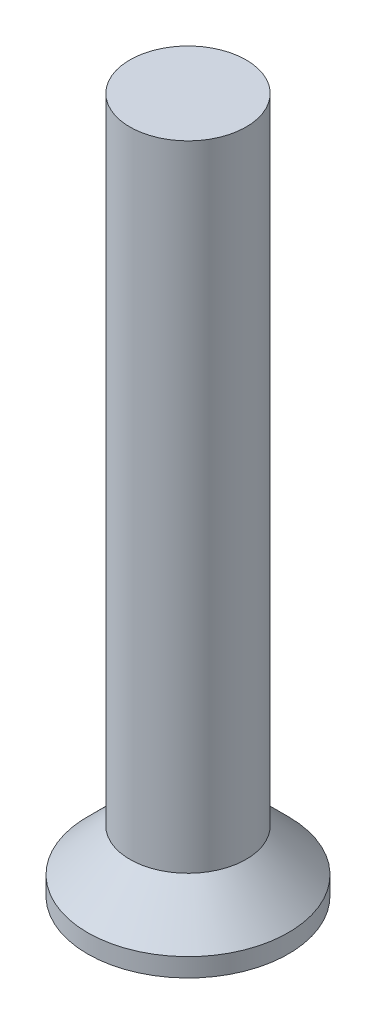
ISO-10303-21;
HEADER;
FILE_DESCRIPTION(('STEP AP214'),'2;1');
FILE_NAME('part.step','',(''),(''),'','','');
FILE_SCHEMA(('AUTOMOTIVE_DESIGN { 1 0 10303 214 1 1 1 1 }'));
ENDSEC;
DATA;
#1=APPLICATION_CONTEXT('core data for automotive mechanical design processes');
#2=APPLICATION_PROTOCOL_DEFINITION('international standard','automotive_design',2000,#1);
#3=PRODUCT_CONTEXT('',#1,'mechanical');
#4=PRODUCT('Part','Part','',(#3));
#5=PRODUCT_RELATED_PRODUCT_CATEGORY('part','',(#4));
#6=PRODUCT_DEFINITION_FORMATION('','',#4);
#7=PRODUCT_DEFINITION_CONTEXT('part definition',#1,'design');
#8=PRODUCT_DEFINITION('design','',#6,#7);
#9=PRODUCT_DEFINITION_SHAPE('','',#8);
#10=(LENGTH_UNIT() NAMED_UNIT(*) SI_UNIT(.MILLI.,.METRE.));
#11=(NAMED_UNIT(*) PLANE_ANGLE_UNIT() SI_UNIT($,.RADIAN.));
#12=(NAMED_UNIT(*) SI_UNIT($,.STERADIAN.) SOLID_ANGLE_UNIT());
#13=UNCERTAINTY_MEASURE_WITH_UNIT(LENGTH_MEASURE(1.E-05),#10,'distance_accuracy_value','');
#14=(GEOMETRIC_REPRESENTATION_CONTEXT(3) GLOBAL_UNCERTAINTY_ASSIGNED_CONTEXT((#13)) GLOBAL_UNIT_ASSIGNED_CONTEXT((#10,
#11,#12)) REPRESENTATION_CONTEXT('',''));
#15=CARTESIAN_POINT('',(0.,0.,0.));
#16=DIRECTION('',(0.,0.,1.));
#17=DIRECTION('',(1.,0.,0.));
#18=AXIS2_PLACEMENT_3D('',#15,#16,#17);
#19=CARTESIAN_POINT('',(1.15,0.45,-0.35));
#20=DIRECTION('',(0.,-1.,0.));
#21=DIRECTION('',(0.,0.,-1.));
#22=AXIS2_PLACEMENT_3D('',#19,#20,#21);
#23=PLANE('',#22);
#24=DIRECTION('',(-0.866025403784437,0.,0.500000000000002));
#25=VECTOR('',#24,1.);
#26=CARTESIAN_POINT('',(0.870963111713216,0.45,-0.813690825427964));
#27=LINE('',#26,#25);
#28=CARTESIAN_POINT('',(0.308073776573569,0.45,-0.488706516261118));
#29=VERTEX_POINT('',#28);
#30=CARTESIAN_POINT('',(0.7354554274295,0.45,-0.735455427429497));
#31=VERTEX_POINT('',#30);
#32=EDGE_CURVE('E151',#29,#31,#27,.F.);
#33=ORIENTED_EDGE('',*,*,#32,.T.);
#34=DIRECTION('',(0.500000000000002,0.,-0.866025403784438));
#35=VECTOR('',#34,1.);
#36=CARTESIAN_POINT('',(0.525015690833154,0.45,-0.370963111713216));
#37=LINE('',#36,#35);
#38=CARTESIAN_POINT('',(0.48870651626112,0.45,-0.308073776573567));
#39=VERTEX_POINT('',#38);
#40=EDGE_CURVE('E153',#31,#39,#37,.F.);
#41=ORIENTED_EDGE('',*,*,#40,.T.);
#42=DIRECTION('',(1.,0.,0.));
#43=VECTOR('',#42,1.);
#44=CARTESIAN_POINT('',(0.561324865405187,0.45,-0.308073776573567));
#45=LINE('',#44,#43);
#46=CARTESIAN_POINT('',(1.10807377657357,0.45,-0.308073776573567));
#47=VERTEX_POINT('',#46);
#48=EDGE_CURVE('E155',#39,#47,#45,.T.);
#49=ORIENTED_EDGE('',*,*,#48,.T.);
#50=DIRECTION('',(0.,0.,1.));
#51=VECTOR('',#50,1.);
#52=CARTESIAN_POINT('',(1.10807377657357,0.45,-0.35));
#53=LINE('',#52,#51);
#54=CARTESIAN_POINT('',(1.10807377657357,0.45,0.308073776573565));
#55=VERTEX_POINT('',#54);
#56=EDGE_CURVE('E245',#47,#55,#53,.T.);
#57=ORIENTED_EDGE('',*,*,#56,.T.);
#58=DIRECTION('',(1.,0.,0.));
#59=VECTOR('',#58,1.);
#60=CARTESIAN_POINT('',(0.561324865405187,0.45,0.308073776573567));
#61=LINE('',#60,#59);
#62=CARTESIAN_POINT('',(0.488706516261121,0.45,0.308073776573566));
#63=VERTEX_POINT('',#62);
#64=EDGE_CURVE('E250',#55,#63,#61,.F.);
#65=ORIENTED_EDGE('',*,*,#64,.T.);
#66=DIRECTION('',(-0.499999999999997,0.,-0.86602540378444));
#67=VECTOR('',#66,1.);
#68=CARTESIAN_POINT('',(0.525015690833154,0.45,0.370963111713216));
#69=LINE('',#68,#67);
#70=CARTESIAN_POINT('',(0.735455427429499,0.45,0.735455427429501));
#71=VERTEX_POINT('',#70);
#72=EDGE_CURVE('E254',#63,#71,#69,.F.);
#73=ORIENTED_EDGE('',*,*,#72,.T.);
#74=DIRECTION('',(0.866025403784434,0.,0.500000000000009));
#75=VECTOR('',#74,1.);
#76=CARTESIAN_POINT('',(0.870963111713217,0.45,0.813690825427969));
#77=LINE('',#76,#75);
#78=CARTESIAN_POINT('',(0.30807377657357,0.45,0.488706516261117));
#79=VERTEX_POINT('',#78);
#80=EDGE_CURVE('E258',#71,#79,#77,.F.);
#81=ORIENTED_EDGE('',*,*,#80,.T.);
#82=DIRECTION('',(0.,0.,1.));
#83=VECTOR('',#82,1.);
#84=CARTESIAN_POINT('',(0.308073776573569,0.45,1.15));
#85=LINE('',#84,#83);
#86=CARTESIAN_POINT('',(0.308073776573569,0.45,1.10807377657356));
#87=VERTEX_POINT('',#86);
#88=EDGE_CURVE('E262',#79,#87,#85,.T.);
#89=ORIENTED_EDGE('',*,*,#88,.T.);
#90=DIRECTION('',(1.,0.,0.));
#91=VECTOR('',#90,1.);
#92=CARTESIAN_POINT('',(-0.349999999999997,0.45,1.10807377657356));
#93=LINE('',#92,#91);
#94=CARTESIAN_POINT('',(-0.308073776573564,0.45,1.10807377657356));
#95=VERTEX_POINT('',#94);
#96=EDGE_CURVE('E266',#87,#95,#93,.F.);
#97=ORIENTED_EDGE('',*,*,#96,.T.);
#98=DIRECTION('',(0.,0.,1.));
#99=VECTOR('',#98,1.);
#100=CARTESIAN_POINT('',(-0.308073776573564,0.45,1.15));
#101=LINE('',#100,#99);
#102=CARTESIAN_POINT('',(-0.308073776573567,0.45,0.488706516261116));
#103=VERTEX_POINT('',#102);
#104=EDGE_CURVE('E270',#95,#103,#101,.F.);
#105=ORIENTED_EDGE('',*,*,#104,.T.);
#106=DIRECTION('',(0.866025403784434,0.,-0.500000000000009));
#107=VECTOR('',#106,1.);
#108=CARTESIAN_POINT('',(-0.870963111713217,0.45,0.813690825427969));
#109=LINE('',#108,#107);
#110=CARTESIAN_POINT('',(-0.735455427429499,0.45,0.7354554274295));
#111=VERTEX_POINT('',#110);
#112=EDGE_CURVE('E274',#103,#111,#109,.F.);
#113=ORIENTED_EDGE('',*,*,#112,.T.);
#114=DIRECTION('',(-0.499999999999997,0.,0.86602540378444));
#115=VECTOR('',#114,1.);
#116=CARTESIAN_POINT('',(-0.525015690833154,0.45,0.370963111713216));
#117=LINE('',#116,#115);
#118=CARTESIAN_POINT('',(-0.488706516261121,0.45,0.308073776573567));
#119=VERTEX_POINT('',#118);
#120=EDGE_CURVE('E278',#111,#119,#117,.F.);
#121=ORIENTED_EDGE('',*,*,#120,.T.);
#122=DIRECTION('',(1.,0.,0.));
#123=VECTOR('',#122,1.);
#124=CARTESIAN_POINT('',(-0.561324865405187,0.45,0.308073776573567));
#125=LINE('',#124,#123);
#126=CARTESIAN_POINT('',(-1.10807377657356,0.45,0.308073776573566));
#127=VERTEX_POINT('',#126);
#128=EDGE_CURVE('E282',#119,#127,#125,.F.);
#129=ORIENTED_EDGE('',*,*,#128,.T.);
#130=DIRECTION('',(0.,0.,1.));
#131=VECTOR('',#130,1.);
#132=CARTESIAN_POINT('',(-1.10807377657356,0.45,-0.349999999999999));
#133=LINE('',#132,#131);
#134=CARTESIAN_POINT('',(-1.10807377657356,0.45,-0.308073776573566));
#135=VERTEX_POINT('',#134);
#136=EDGE_CURVE('E286',#127,#135,#133,.F.);
#137=ORIENTED_EDGE('',*,*,#136,.T.);
#138=DIRECTION('',(1.,0.,0.));
#139=VECTOR('',#138,1.);
#140=CARTESIAN_POINT('',(-0.561324865405187,0.45,-0.308073776573567));
#141=LINE('',#140,#139);
#142=CARTESIAN_POINT('',(-0.488706516261121,0.45,-0.308073776573567));
#143=VERTEX_POINT('',#142);
#144=EDGE_CURVE('E290',#135,#143,#141,.T.);
#145=ORIENTED_EDGE('',*,*,#144,.T.);
#146=DIRECTION('',(0.500000000000002,0.,0.866025403784438));
#147=VECTOR('',#146,1.);
#148=CARTESIAN_POINT('',(-0.525015690833154,0.45,-0.370963111713216));
#149=LINE('',#148,#147);
#150=CARTESIAN_POINT('',(-0.7354554274295,0.45,-0.735455427429497));
#151=VERTEX_POINT('',#150);
#152=EDGE_CURVE('E294',#143,#151,#149,.F.);
#153=ORIENTED_EDGE('',*,*,#152,.T.);
#154=DIRECTION('',(-0.866025403784437,0.,-0.500000000000002));
#155=VECTOR('',#154,1.);
#156=CARTESIAN_POINT('',(-0.870963111713216,0.45,-0.813690825427964));
#157=LINE('',#156,#155);
#158=CARTESIAN_POINT('',(-0.30807377657357,0.45,-0.488706516261118));
#159=VERTEX_POINT('',#158);
#160=EDGE_CURVE('E298',#151,#159,#157,.F.);
#161=ORIENTED_EDGE('',*,*,#160,.T.);
#162=DIRECTION('',(0.,0.,1.));
#163=VECTOR('',#162,1.);
#164=CARTESIAN_POINT('',(-0.308073776573563,0.45,-1.15));
#165=LINE('',#164,#163);
#166=CARTESIAN_POINT('',(-0.308073776573567,0.45,-1.10807377657356));
#167=VERTEX_POINT('',#166);
#168=EDGE_CURVE('E302',#159,#167,#165,.F.);
#169=ORIENTED_EDGE('',*,*,#168,.T.);
#170=DIRECTION('',(1.,0.,0.));
#171=VECTOR('',#170,1.);
#172=CARTESIAN_POINT('',(-0.349999999999996,0.45,-1.10807377657356));
#173=LINE('',#172,#171);
#174=CARTESIAN_POINT('',(0.308073776573569,0.45,-1.10807377657356));
#175=VERTEX_POINT('',#174);
#176=EDGE_CURVE('E306',#167,#175,#173,.T.);
#177=ORIENTED_EDGE('',*,*,#176,.T.);
#178=DIRECTION('',(0.,0.,1.));
#179=VECTOR('',#178,1.);
#180=CARTESIAN_POINT('',(0.308073776573569,0.45,-1.15));
#181=LINE('',#180,#179);
#182=EDGE_CURVE('E310',#175,#29,#181,.T.);
#183=ORIENTED_EDGE('',*,*,#182,.T.);
#184=EDGE_LOOP('',(#33,#41,#49,#57,#65,#73,#81,#89,#97,#105,#113,#121,#129,#137,#145,#153,#161,
#169,#177,#183));
#185=FACE_BOUND('',#184,.T.);
#186=ADVANCED_FACE('F16',(#185),#23,.T.);
#187=CARTESIAN_POINT('',(0.561324865405187,-0.35,-0.35));
#188=DIRECTION('',(0.,0.0523359562429439,-0.998629534754574));
#189=DIRECTION('',(0.,0.998629534754574,0.0523359562429439));
#190=AXIS2_PLACEMENT_3D('',#187,#188,#189);
#191=PLANE('',#190);
#192=DIRECTION('',(-0.052264427688714,0.997264688634237,0.0522644276887139));
#193=VECTOR('',#192,1.);
#194=CARTESIAN_POINT('',(1.15,-0.35,-0.35));
#195=LINE('',#194,#193);
#196=CARTESIAN_POINT('',(1.15,-0.35,-0.35));
#197=VERTEX_POINT('',#196);
#198=EDGE_CURVE('E166',#197,#47,#195,.T.);
#199=ORIENTED_EDGE('',*,*,#198,.T.);
#200=ORIENTED_EDGE('',*,*,#48,.F.);
#201=DIRECTION('',(0.0902783783273546,-0.994551700956488,-0.0521222460293009));
#202=VECTOR('',#201,1.);
#203=CARTESIAN_POINT('',(0.48870651626112,0.45,-0.308073776573567));
#204=LINE('',#203,#202);
#205=CARTESIAN_POINT('',(0.561324865405187,-0.35,-0.35));
#206=VERTEX_POINT('',#205);
#207=EDGE_CURVE('E160',#39,#206,#204,.T.);
#208=ORIENTED_EDGE('',*,*,#207,.T.);
#209=DIRECTION('',(1.,0.,0.));
#210=VECTOR('',#209,1.);
#211=CARTESIAN_POINT('',(0.,-0.35,-0.35));
#212=LINE('',#211,#210);
#213=EDGE_CURVE('E242',#197,#206,#212,.F.);
#214=ORIENTED_EDGE('',*,*,#213,.F.);
#215=EDGE_LOOP('',(#199,#200,#208,#214));
#216=FACE_BOUND('',#215,.T.);
#217=ADVANCED_FACE('F163',(#216),#191,.F.);
#218=CARTESIAN_POINT('',(0.561324865405187,-0.35,-0.35));
#219=DIRECTION('',(0.864838546066895,0.0523359562429439,0.499314767377288));
#220=DIRECTION('',(0.500000000000002,0.,-0.866025403784438));
#221=AXIS2_PLACEMENT_3D('',#218,#219,#220);
#222=PLANE('',#221);
#223=ORIENTED_EDGE('',*,*,#207,.F.);
#224=ORIENTED_EDGE('',*,*,#40,.F.);
#225=DIRECTION('',(0.14033269477898,-0.980108906985412,-0.14033269477898));
#226=VECTOR('',#225,1.);
#227=CARTESIAN_POINT('',(0.7354554274295,0.45,-0.735455427429497));
#228=LINE('',#227,#226);
#229=CARTESIAN_POINT('',(0.85,-0.35,-0.849999999999997));
#230=VERTEX_POINT('',#229);
#231=EDGE_CURVE('E174',#31,#230,#228,.T.);
#232=ORIENTED_EDGE('',*,*,#231,.T.);
#233=DIRECTION('',(0.500000000000002,0.,-0.866025403784438));
#234=VECTOR('',#233,1.);
#235=CARTESIAN_POINT('',(0.561324865405187,-0.35,-0.35));
#236=LINE('',#235,#234);
#237=EDGE_CURVE('E171',#206,#230,#236,.T.);
#238=ORIENTED_EDGE('',*,*,#237,.F.);
#239=EDGE_LOOP('',(#223,#224,#232,#238));
#240=FACE_BOUND('',#239,.T.);
#241=ADVANCED_FACE('F169',(#240),#222,.F.);
#242=CARTESIAN_POINT('',(0.85,-0.35,-0.849999999999997));
#243=DIRECTION('',(-0.499314767377289,0.0523359562429439,-0.864838546066895));
#244=DIRECTION('',(-0.866025403784437,0.,0.500000000000002));
#245=AXIS2_PLACEMENT_3D('',#242,#243,#244);
#246=PLANE('',#245);
#247=ORIENTED_EDGE('',*,*,#231,.F.);
#248=ORIENTED_EDGE('',*,*,#32,.F.);
#249=DIRECTION('',(0.0521222460293009,-0.994551700956488,-0.0902783783273545));
#250=VECTOR('',#249,1.);
#251=CARTESIAN_POINT('',(0.308073776573569,0.45,-0.488706516261118));
#252=LINE('',#251,#250);
#253=CARTESIAN_POINT('',(0.350000000000002,-0.35,-0.561324865405185));
#254=VERTEX_POINT('',#253);
#255=EDGE_CURVE('E308',#29,#254,#252,.T.);
#256=ORIENTED_EDGE('',*,*,#255,.T.);
#257=DIRECTION('',(-0.866025403784437,0.,0.500000000000002));
#258=VECTOR('',#257,1.);
#259=CARTESIAN_POINT('',(0.85,-0.35,-0.849999999999997));
#260=LINE('',#259,#258);
#261=EDGE_CURVE('E238',#230,#254,#260,.T.);
#262=ORIENTED_EDGE('',*,*,#261,.F.);
#263=EDGE_LOOP('',(#247,#248,#256,#262));
#264=FACE_BOUND('',#263,.T.);
#265=ADVANCED_FACE('F313',(#264),#246,.F.);
#266=CARTESIAN_POINT('',(0.350000000000002,-0.35,-1.15));
#267=DIRECTION('',(0.998629534754574,0.0523359562429439,0.));
#268=DIRECTION('',(-0.0523359562429439,0.998629534754574,0.));
#269=AXIS2_PLACEMENT_3D('',#266,#267,#268);
#270=PLANE('',#269);
#271=ORIENTED_EDGE('',*,*,#255,.F.);
#272=ORIENTED_EDGE('',*,*,#182,.F.);
#273=DIRECTION('',(0.0522644276887139,-0.997264688634237,-0.052264427688714));
#274=VECTOR('',#273,1.);
#275=CARTESIAN_POINT('',(0.308073776573569,0.45,-1.10807377657356));
#276=LINE('',#275,#274);
#277=CARTESIAN_POINT('',(0.350000000000002,-0.35,-1.15));
#278=VERTEX_POINT('',#277);
#279=EDGE_CURVE('E304',#175,#278,#276,.T.);
#280=ORIENTED_EDGE('',*,*,#279,.T.);
#281=DIRECTION('',(0.,0.,-1.));
#282=VECTOR('',#281,1.);
#283=CARTESIAN_POINT('',(0.350000000000002,-0.35,0.));
#284=LINE('',#283,#282);
#285=EDGE_CURVE('E235',#254,#278,#284,.T.);
#286=ORIENTED_EDGE('',*,*,#285,.F.);
#287=EDGE_LOOP('',(#271,#272,#280,#286));
#288=FACE_BOUND('',#287,.T.);
#289=ADVANCED_FACE('F394',(#288),#270,.F.);
#290=CARTESIAN_POINT('',(-0.349999999999996,-0.35,-1.15));
#291=DIRECTION('',(0.,0.0523359562429439,-0.998629534754574));
#292=DIRECTION('',(0.,0.998629534754574,0.0523359562429439));
#293=AXIS2_PLACEMENT_3D('',#290,#291,#292);
#294=PLANE('',#293);
#295=ORIENTED_EDGE('',*,*,#279,.F.);
#296=ORIENTED_EDGE('',*,*,#176,.F.);
#297=DIRECTION('',(-0.0522644276887134,-0.997264688634237,-0.0522644276887143));
#298=VECTOR('',#297,1.);
#299=CARTESIAN_POINT('',(-0.308073776573564,0.45,-1.10807377657356));
#300=LINE('',#299,#298);
#301=CARTESIAN_POINT('',(-0.349999999999996,-0.35,-1.15));
#302=VERTEX_POINT('',#301);
#303=EDGE_CURVE('E300',#167,#302,#300,.T.);
#304=ORIENTED_EDGE('',*,*,#303,.T.);
#305=DIRECTION('',(1.,0.,0.));
#306=VECTOR('',#305,1.);
#307=CARTESIAN_POINT('',(0.,-0.35,-1.15));
#308=LINE('',#307,#306);
#309=EDGE_CURVE('E232',#278,#302,#308,.F.);
#310=ORIENTED_EDGE('',*,*,#309,.F.);
#311=EDGE_LOOP('',(#295,#296,#304,#310));
#312=FACE_BOUND('',#311,.T.);
#313=ADVANCED_FACE('F391',(#312),#294,.F.);
#314=CARTESIAN_POINT('',(-0.349999999999996,-0.35,-1.15));
#315=DIRECTION('',(-0.998629534754574,0.0523359562429439,0.));
#316=DIRECTION('',(-0.0523359562429439,-0.998629534754574,0.));
#317=AXIS2_PLACEMENT_3D('',#314,#315,#316);
#318=PLANE('',#317);
#319=ORIENTED_EDGE('',*,*,#303,.F.);
#320=ORIENTED_EDGE('',*,*,#168,.F.);
#321=DIRECTION('',(-0.0521222460292999,-0.994551700956488,-0.090278378327354));
#322=VECTOR('',#321,1.);
#323=CARTESIAN_POINT('',(-0.30807377657357,0.45,-0.488706516261118));
#324=LINE('',#323,#322);
#325=CARTESIAN_POINT('',(-0.350000000000001,-0.35,-0.561324865405184));
#326=VERTEX_POINT('',#325);
#327=EDGE_CURVE('E296',#159,#326,#324,.T.);
#328=ORIENTED_EDGE('',*,*,#327,.T.);
#329=DIRECTION('',(0.,0.,-1.));
#330=VECTOR('',#329,1.);
#331=CARTESIAN_POINT('',(-0.349999999999996,-0.35,0.));
#332=LINE('',#331,#330);
#333=EDGE_CURVE('E229',#302,#326,#332,.F.);
#334=ORIENTED_EDGE('',*,*,#333,.F.);
#335=EDGE_LOOP('',(#319,#320,#328,#334));
#336=FACE_BOUND('',#335,.T.);
#337=ADVANCED_FACE('F386',(#336),#318,.F.);
#338=CARTESIAN_POINT('',(-0.85,-0.35,-0.849999999999997));
#339=DIRECTION('',(0.499314767377289,0.0523359562429439,-0.864838546066895));
#340=DIRECTION('',(-0.866025403784437,0.,-0.500000000000002));
#341=AXIS2_PLACEMENT_3D('',#338,#339,#340);
#342=PLANE('',#341);
#343=ORIENTED_EDGE('',*,*,#327,.F.);
#344=ORIENTED_EDGE('',*,*,#160,.F.);
#345=DIRECTION('',(-0.14033269477898,-0.980108906985412,-0.14033269477898));
#346=VECTOR('',#345,1.);
#347=CARTESIAN_POINT('',(-0.7354554274295,0.45,-0.735455427429497));
#348=LINE('',#347,#346);
#349=CARTESIAN_POINT('',(-0.85,-0.35,-0.849999999999997));
#350=VERTEX_POINT('',#349);
#351=EDGE_CURVE('E292',#151,#350,#348,.T.);
#352=ORIENTED_EDGE('',*,*,#351,.T.);
#353=DIRECTION('',(-0.866025403784437,0.,-0.500000000000002));
#354=VECTOR('',#353,1.);
#355=CARTESIAN_POINT('',(-0.350000000000002,-0.35,-0.561324865405185));
#356=LINE('',#355,#354);
#357=EDGE_CURVE('E226',#326,#350,#356,.T.);
#358=ORIENTED_EDGE('',*,*,#357,.F.);
#359=EDGE_LOOP('',(#343,#344,#352,#358));
#360=FACE_BOUND('',#359,.T.);
#361=ADVANCED_FACE('F381',(#360),#342,.F.);
#362=CARTESIAN_POINT('',(-0.561324865405187,-0.35,-0.35));
#363=DIRECTION('',(-0.864838546066895,0.0523359562429439,0.499314767377288));
#364=DIRECTION('',(0.500000000000002,0.,0.866025403784438));
#365=AXIS2_PLACEMENT_3D('',#362,#363,#364);
#366=PLANE('',#365);
#367=ORIENTED_EDGE('',*,*,#351,.F.);
#368=ORIENTED_EDGE('',*,*,#152,.F.);
#369=DIRECTION('',(-0.0902783783273543,-0.994551700956488,-0.0521222460293008));
#370=VECTOR('',#369,1.);
#371=CARTESIAN_POINT('',(-0.488706516261121,0.45,-0.308073776573567));
#372=LINE('',#371,#370);
#373=CARTESIAN_POINT('',(-0.561324865405187,-0.35,-0.35));
#374=VERTEX_POINT('',#373);
#375=EDGE_CURVE('E288',#143,#374,#372,.T.);
#376=ORIENTED_EDGE('',*,*,#375,.T.);
#377=DIRECTION('',(0.500000000000002,0.,0.866025403784438));
#378=VECTOR('',#377,1.);
#379=CARTESIAN_POINT('',(-0.85,-0.35,-0.849999999999997));
#380=LINE('',#379,#378);
#381=EDGE_CURVE('E223',#350,#374,#380,.T.);
#382=ORIENTED_EDGE('',*,*,#381,.F.);
#383=EDGE_LOOP('',(#367,#368,#376,#382));
#384=FACE_BOUND('',#383,.T.);
#385=ADVANCED_FACE('F376',(#384),#366,.F.);
#386=CARTESIAN_POINT('',(-0.561324865405187,-0.35,-0.35));
#387=DIRECTION('',(0.,0.0523359562429439,-0.998629534754574));
#388=DIRECTION('',(0.,0.998629534754574,0.0523359562429439));
#389=AXIS2_PLACEMENT_3D('',#386,#387,#388);
#390=PLANE('',#389);
#391=ORIENTED_EDGE('',*,*,#375,.F.);
#392=ORIENTED_EDGE('',*,*,#144,.F.);
#393=DIRECTION('',(-0.052264427688714,-0.997264688634237,-0.052264427688714));
#394=VECTOR('',#393,1.);
#395=CARTESIAN_POINT('',(-1.10807377657356,0.45,-0.308073776573566));
#396=LINE('',#395,#394);
#397=CARTESIAN_POINT('',(-1.14999999999999,-0.35,-0.35));
#398=VERTEX_POINT('',#397);
#399=EDGE_CURVE('E284',#135,#398,#396,.T.);
#400=ORIENTED_EDGE('',*,*,#399,.T.);
#401=DIRECTION('',(1.,0.,0.));
#402=VECTOR('',#401,1.);
#403=CARTESIAN_POINT('',(0.,-0.35,-0.35));
#404=LINE('',#403,#402);
#405=EDGE_CURVE('E220',#374,#398,#404,.F.);
#406=ORIENTED_EDGE('',*,*,#405,.F.);
#407=EDGE_LOOP('',(#391,#392,#400,#406));
#408=FACE_BOUND('',#407,.T.);
#409=ADVANCED_FACE('F371',(#408),#390,.F.);
#410=CARTESIAN_POINT('',(-1.14999999999999,-0.35,-0.349999999999999));
#411=DIRECTION('',(-0.998629534754574,0.0523359562429439,0.));
#412=DIRECTION('',(-0.0523359562429439,-0.998629534754574,0.));
#413=AXIS2_PLACEMENT_3D('',#410,#411,#412);
#414=PLANE('',#413);
#415=ORIENTED_EDGE('',*,*,#399,.F.);
#416=ORIENTED_EDGE('',*,*,#136,.F.);
#417=DIRECTION('',(-0.052264427688714,-0.997264688634237,0.0522644276887139));
#418=VECTOR('',#417,1.);
#419=CARTESIAN_POINT('',(-1.10807377657356,0.45,0.308073776573566));
#420=LINE('',#419,#418);
#421=CARTESIAN_POINT('',(-1.14999999999999,-0.35,0.349999999999999));
#422=VERTEX_POINT('',#421);
#423=EDGE_CURVE('E280',#127,#422,#420,.T.);
#424=ORIENTED_EDGE('',*,*,#423,.T.);
#425=DIRECTION('',(0.,0.,-1.));
#426=VECTOR('',#425,1.);
#427=CARTESIAN_POINT('',(-1.14999999999999,-0.35,0.));
#428=LINE('',#427,#426);
#429=EDGE_CURVE('E217',#398,#422,#428,.F.);
#430=ORIENTED_EDGE('',*,*,#429,.F.);
#431=EDGE_LOOP('',(#415,#416,#424,#430));
#432=FACE_BOUND('',#431,.T.);
#433=ADVANCED_FACE('F366',(#432),#414,.F.);
#434=CARTESIAN_POINT('',(-0.561324865405187,-0.35,0.35));
#435=DIRECTION('',(0.,0.0523359562429439,0.998629534754574));
#436=DIRECTION('',(0.,-0.998629534754574,0.0523359562429439));
#437=AXIS2_PLACEMENT_3D('',#434,#435,#436);
#438=PLANE('',#437);
#439=ORIENTED_EDGE('',*,*,#423,.F.);
#440=ORIENTED_EDGE('',*,*,#128,.F.);
#441=DIRECTION('',(-0.0902783783273539,-0.994551700956488,0.0521222460293008));
#442=VECTOR('',#441,1.);
#443=CARTESIAN_POINT('',(-0.488706516261121,0.45,0.308073776573567));
#444=LINE('',#443,#442);
#445=CARTESIAN_POINT('',(-0.561324865405187,-0.35,0.35));
#446=VERTEX_POINT('',#445);
#447=EDGE_CURVE('E276',#119,#446,#444,.T.);
#448=ORIENTED_EDGE('',*,*,#447,.T.);
#449=DIRECTION('',(1.,0.,0.));
#450=VECTOR('',#449,1.);
#451=CARTESIAN_POINT('',(0.,-0.35,0.349999999999999));
#452=LINE('',#451,#450);
#453=EDGE_CURVE('E214',#422,#446,#452,.T.);
#454=ORIENTED_EDGE('',*,*,#453,.F.);
#455=EDGE_LOOP('',(#439,#440,#448,#454));
#456=FACE_BOUND('',#455,.T.);
#457=ADVANCED_FACE('F361',(#456),#438,.F.);
#458=CARTESIAN_POINT('',(-0.561324865405187,-0.35,0.35));
#459=DIRECTION('',(-0.864838546066898,0.0523359562429439,-0.499314767377285));
#460=DIRECTION('',(-0.499999999999997,0.,0.86602540378444));
#461=AXIS2_PLACEMENT_3D('',#458,#459,#460);
#462=PLANE('',#461);
#463=ORIENTED_EDGE('',*,*,#447,.F.);
#464=ORIENTED_EDGE('',*,*,#120,.F.);
#465=DIRECTION('',(-0.14033269477898,-0.980108906985412,0.140332694778982));
#466=VECTOR('',#465,1.);
#467=CARTESIAN_POINT('',(-0.735455427429499,0.45,0.7354554274295));
#468=LINE('',#467,#466);
#469=CARTESIAN_POINT('',(-0.85,-0.35,0.850000000000002));
#470=VERTEX_POINT('',#469);
#471=EDGE_CURVE('E272',#111,#470,#468,.T.);
#472=ORIENTED_EDGE('',*,*,#471,.T.);
#473=DIRECTION('',(-0.499999999999998,0.,0.86602540378444));
#474=VECTOR('',#473,1.);
#475=CARTESIAN_POINT('',(-0.561324865405187,-0.35,0.35));
#476=LINE('',#475,#474);
#477=EDGE_CURVE('E211',#446,#470,#476,.T.);
#478=ORIENTED_EDGE('',*,*,#477,.F.);
#479=EDGE_LOOP('',(#463,#464,#472,#478));
#480=FACE_BOUND('',#479,.T.);
#481=ADVANCED_FACE('F356',(#480),#462,.F.);
#482=CARTESIAN_POINT('',(-0.85,-0.35,0.850000000000002));
#483=DIRECTION('',(0.499314767377296,0.0523359562429439,0.864838546066891));
#484=DIRECTION('',(0.866025403784434,0.,-0.500000000000009));
#485=AXIS2_PLACEMENT_3D('',#482,#483,#484);
#486=PLANE('',#485);
#487=ORIENTED_EDGE('',*,*,#471,.F.);
#488=ORIENTED_EDGE('',*,*,#112,.F.);
#489=DIRECTION('',(-0.0521222460293,-0.994551700956488,0.0902783783273547));
#490=VECTOR('',#489,1.);
#491=CARTESIAN_POINT('',(-0.30807377657357,0.45,0.488706516261117));
#492=LINE('',#491,#490);
#493=CARTESIAN_POINT('',(-0.350000000000003,-0.35,0.561324865405184));
#494=VERTEX_POINT('',#493);
#495=EDGE_CURVE('E268',#103,#494,#492,.T.);
#496=ORIENTED_EDGE('',*,*,#495,.T.);
#497=DIRECTION('',(0.866025403784434,0.,-0.500000000000009));
#498=VECTOR('',#497,1.);
#499=CARTESIAN_POINT('',(-0.85,-0.35,0.850000000000002));
#500=LINE('',#499,#498);
#501=EDGE_CURVE('E208',#470,#494,#500,.T.);
#502=ORIENTED_EDGE('',*,*,#501,.F.);
#503=EDGE_LOOP('',(#487,#488,#496,#502));
#504=FACE_BOUND('',#503,.T.);
#505=ADVANCED_FACE('F351',(#504),#486,.F.);
#506=CARTESIAN_POINT('',(-0.349999999999997,-0.35,1.15));
#507=DIRECTION('',(-0.998629534754574,0.0523359562429439,0.));
#508=DIRECTION('',(-0.0523359562429439,-0.998629534754574,0.));
#509=AXIS2_PLACEMENT_3D('',#506,#507,#508);
#510=PLANE('',#509);
#511=ORIENTED_EDGE('',*,*,#495,.F.);
#512=ORIENTED_EDGE('',*,*,#104,.F.);
#513=DIRECTION('',(-0.0522644276887134,-0.997264688634237,0.052264427688714));
#514=VECTOR('',#513,1.);
#515=CARTESIAN_POINT('',(-0.308073776573564,0.45,1.10807377657356));
#516=LINE('',#515,#514);
#517=CARTESIAN_POINT('',(-0.349999999999998,-0.35,1.15));
#518=VERTEX_POINT('',#517);
#519=EDGE_CURVE('E264',#95,#518,#516,.T.);
#520=ORIENTED_EDGE('',*,*,#519,.T.);
#521=DIRECTION('',(0.,0.,-1.));
#522=VECTOR('',#521,1.);
#523=CARTESIAN_POINT('',(-0.350000000000003,-0.35,0.));
#524=LINE('',#523,#522);
#525=EDGE_CURVE('E205',#494,#518,#524,.F.);
#526=ORIENTED_EDGE('',*,*,#525,.F.);
#527=EDGE_LOOP('',(#511,#512,#520,#526));
#528=FACE_BOUND('',#527,.T.);
#529=ADVANCED_FACE('F346',(#528),#510,.F.);
#530=CARTESIAN_POINT('',(-0.349999999999997,-0.35,1.15));
#531=DIRECTION('',(0.,0.0523359562429439,0.998629534754574));
#532=DIRECTION('',(0.,-0.998629534754574,0.0523359562429439));
#533=AXIS2_PLACEMENT_3D('',#530,#531,#532);
#534=PLANE('',#533);
#535=ORIENTED_EDGE('',*,*,#519,.F.);
#536=ORIENTED_EDGE('',*,*,#96,.F.);
#537=DIRECTION('',(0.0522644276887139,-0.997264688634237,0.0522644276887143));
#538=VECTOR('',#537,1.);
#539=CARTESIAN_POINT('',(0.308073776573569,0.45,1.10807377657356));
#540=LINE('',#539,#538);
#541=CARTESIAN_POINT('',(0.350000000000002,-0.35,1.15));
#542=VERTEX_POINT('',#541);
#543=EDGE_CURVE('E260',#87,#542,#540,.T.);
#544=ORIENTED_EDGE('',*,*,#543,.T.);
#545=DIRECTION('',(1.,0.,0.));
#546=VECTOR('',#545,1.);
#547=CARTESIAN_POINT('',(0.,-0.35,1.15));
#548=LINE('',#547,#546);
#549=EDGE_CURVE('E202',#518,#542,#548,.T.);
#550=ORIENTED_EDGE('',*,*,#549,.F.);
#551=EDGE_LOOP('',(#535,#536,#544,#550));
#552=FACE_BOUND('',#551,.T.);
#553=ADVANCED_FACE('F341',(#552),#534,.F.);
#554=CARTESIAN_POINT('',(0.350000000000002,-0.35,1.15));
#555=DIRECTION('',(0.998629534754574,0.0523359562429439,0.));
#556=DIRECTION('',(-0.0523359562429439,0.998629534754574,0.));
#557=AXIS2_PLACEMENT_3D('',#554,#555,#556);
#558=PLANE('',#557);
#559=ORIENTED_EDGE('',*,*,#543,.F.);
#560=ORIENTED_EDGE('',*,*,#88,.F.);
#561=DIRECTION('',(0.0521222460293008,-0.994551700956488,0.0902783783273554));
#562=VECTOR('',#561,1.);
#563=CARTESIAN_POINT('',(0.30807377657357,0.45,0.488706516261117));
#564=LINE('',#563,#562);
#565=CARTESIAN_POINT('',(0.350000000000002,-0.35,0.561324865405184));
#566=VERTEX_POINT('',#565);
#567=EDGE_CURVE('E256',#79,#566,#564,.T.);
#568=ORIENTED_EDGE('',*,*,#567,.T.);
#569=DIRECTION('',(0.,0.,-1.));
#570=VECTOR('',#569,1.);
#571=CARTESIAN_POINT('',(0.350000000000002,-0.35,0.));
#572=LINE('',#571,#570);
#573=EDGE_CURVE('E199',#542,#566,#572,.T.);
#574=ORIENTED_EDGE('',*,*,#573,.F.);
#575=EDGE_LOOP('',(#559,#560,#568,#574));
#576=FACE_BOUND('',#575,.T.);
#577=ADVANCED_FACE('F336',(#576),#558,.F.);
#578=CARTESIAN_POINT('',(0.85,-0.35,0.850000000000002));
#579=DIRECTION('',(-0.499314767377296,0.0523359562429439,0.864838546066891));
#580=DIRECTION('',(0.866025403784434,0.,0.500000000000009));
#581=AXIS2_PLACEMENT_3D('',#578,#579,#580);
#582=PLANE('',#581);
#583=ORIENTED_EDGE('',*,*,#567,.F.);
#584=ORIENTED_EDGE('',*,*,#80,.F.);
#585=DIRECTION('',(0.14033269477898,-0.980108906985412,0.140332694778982));
#586=VECTOR('',#585,1.);
#587=CARTESIAN_POINT('',(0.735455427429499,0.45,0.7354554274295));
#588=LINE('',#587,#586);
#589=CARTESIAN_POINT('',(0.85,-0.35,0.850000000000002));
#590=VERTEX_POINT('',#589);
#591=EDGE_CURVE('E252',#71,#590,#588,.T.);
#592=ORIENTED_EDGE('',*,*,#591,.T.);
#593=DIRECTION('',(0.866025403784434,0.,0.500000000000009));
#594=VECTOR('',#593,1.);
#595=CARTESIAN_POINT('',(0.350000000000003,-0.35,0.561324865405184));
#596=LINE('',#595,#594);
#597=EDGE_CURVE('E196',#566,#590,#596,.T.);
#598=ORIENTED_EDGE('',*,*,#597,.F.);
#599=EDGE_LOOP('',(#583,#584,#592,#598));
#600=FACE_BOUND('',#599,.T.);
#601=ADVANCED_FACE('F331',(#600),#582,.F.);
#602=CARTESIAN_POINT('',(0.561324865405187,-0.35,0.35));
#603=DIRECTION('',(0.864838546066898,0.0523359562429439,-0.499314767377285));
#604=DIRECTION('',(-0.499999999999997,0.,-0.86602540378444));
#605=AXIS2_PLACEMENT_3D('',#602,#603,#604);
#606=PLANE('',#605);
#607=ORIENTED_EDGE('',*,*,#591,.F.);
#608=ORIENTED_EDGE('',*,*,#72,.F.);
#609=DIRECTION('',(0.0902783783273538,-0.994551700956488,0.0521222460293007));
#610=VECTOR('',#609,1.);
#611=CARTESIAN_POINT('',(0.488706516261121,0.45,0.308073776573567));
#612=LINE('',#611,#610);
#613=CARTESIAN_POINT('',(0.561324865405187,-0.35,0.35));
#614=VERTEX_POINT('',#613);
#615=EDGE_CURVE('E248',#63,#614,#612,.T.);
#616=ORIENTED_EDGE('',*,*,#615,.T.);
#617=DIRECTION('',(-0.499999999999998,0.,-0.86602540378444));
#618=VECTOR('',#617,1.);
#619=CARTESIAN_POINT('',(0.85,-0.35,0.850000000000002));
#620=LINE('',#619,#618);
#621=EDGE_CURVE('E193',#590,#614,#620,.T.);
#622=ORIENTED_EDGE('',*,*,#621,.F.);
#623=EDGE_LOOP('',(#607,#608,#616,#622));
#624=FACE_BOUND('',#623,.T.);
#625=ADVANCED_FACE('F326',(#624),#606,.F.);
#626=CARTESIAN_POINT('',(0.561324865405187,-0.35,0.35));
#627=DIRECTION('',(0.,0.0523359562429439,0.998629534754574));
#628=DIRECTION('',(0.,-0.998629534754574,0.0523359562429439));
#629=AXIS2_PLACEMENT_3D('',#626,#627,#628);
#630=PLANE('',#629);
#631=ORIENTED_EDGE('',*,*,#615,.F.);
#632=ORIENTED_EDGE('',*,*,#64,.F.);
#633=DIRECTION('',(0.052264427688714,-0.997264688634237,0.0522644276887139));
#634=VECTOR('',#633,1.);
#635=CARTESIAN_POINT('',(1.10807377657357,0.45,0.308073776573565));
#636=LINE('',#635,#634);
#637=CARTESIAN_POINT('',(1.15,-0.35,0.349999999999999));
#638=VERTEX_POINT('',#637);
#639=EDGE_CURVE('E34',#55,#638,#636,.T.);
#640=ORIENTED_EDGE('',*,*,#639,.T.);
#641=DIRECTION('',(1.,0.,0.));
#642=VECTOR('',#641,1.);
#643=CARTESIAN_POINT('',(0.,-0.35,0.35));
#644=LINE('',#643,#642);
#645=EDGE_CURVE('E190',#614,#638,#644,.T.);
#646=ORIENTED_EDGE('',*,*,#645,.F.);
#647=EDGE_LOOP('',(#631,#632,#640,#646));
#648=FACE_BOUND('',#647,.T.);
#649=ADVANCED_FACE('F322',(#648),#630,.F.);
#650=CARTESIAN_POINT('',(1.15,-0.35,-0.35));
#651=DIRECTION('',(0.998629534754574,0.0523359562429439,0.));
#652=DIRECTION('',(-0.0523359562429439,0.998629534754574,0.));
#653=AXIS2_PLACEMENT_3D('',#650,#651,#652);
#654=PLANE('',#653);
#655=ORIENTED_EDGE('',*,*,#639,.F.);
#656=ORIENTED_EDGE('',*,*,#56,.F.);
#657=ORIENTED_EDGE('',*,*,#198,.F.);
#658=DIRECTION('',(0.,0.,-1.));
#659=VECTOR('',#658,1.);
#660=CARTESIAN_POINT('',(1.15,-0.35,0.));
#661=LINE('',#660,#659);
#662=EDGE_CURVE('E186',#638,#197,#661,.T.);
#663=ORIENTED_EDGE('',*,*,#662,.F.);
#664=EDGE_LOOP('',(#655,#656,#657,#663));
#665=FACE_BOUND('',#664,.T.);
#666=ADVANCED_FACE('F319',(#665),#654,.F.);
#667=CARTESIAN_POINT('',(0.,-0.35,0.));
#668=DIRECTION('',(0.,-1.,0.));
#669=DIRECTION('',(0.,0.,-1.));
#670=AXIS2_PLACEMENT_3D('',#667,#668,#669);
#671=PLANE('',#670);
#672=CARTESIAN_POINT('',(0.,-0.35,0.));
#673=DIRECTION('',(0.,1.,0.));
#674=DIRECTION('',(0.,0.,1.));
#675=AXIS2_PLACEMENT_3D('',#672,#673,#674);
#676=CIRCLE('',#675,1.9);
#677=CARTESIAN_POINT('',(0.,-0.35,1.9));
#678=VERTEX_POINT('',#677);
#679=EDGE_CURVE('E19',#678,#678,#676,.T.);
#680=ORIENTED_EDGE('',*,*,#679,.F.);
#681=EDGE_LOOP('',(#680));
#682=FACE_BOUND('',#681,.T.);
#683=ORIENTED_EDGE('',*,*,#645,.T.);
#684=ORIENTED_EDGE('',*,*,#662,.T.);
#685=ORIENTED_EDGE('',*,*,#213,.T.);
#686=ORIENTED_EDGE('',*,*,#237,.T.);
#687=ORIENTED_EDGE('',*,*,#261,.T.);
#688=ORIENTED_EDGE('',*,*,#285,.T.);
#689=ORIENTED_EDGE('',*,*,#309,.T.);
#690=ORIENTED_EDGE('',*,*,#333,.T.);
#691=ORIENTED_EDGE('',*,*,#357,.T.);
#692=ORIENTED_EDGE('',*,*,#381,.T.);
#693=ORIENTED_EDGE('',*,*,#405,.T.);
#694=ORIENTED_EDGE('',*,*,#429,.T.);
#695=ORIENTED_EDGE('',*,*,#453,.T.);
#696=ORIENTED_EDGE('',*,*,#477,.T.);
#697=ORIENTED_EDGE('',*,*,#501,.T.);
#698=ORIENTED_EDGE('',*,*,#525,.T.);
#699=ORIENTED_EDGE('',*,*,#549,.T.);
#700=ORIENTED_EDGE('',*,*,#573,.T.);
#701=ORIENTED_EDGE('',*,*,#597,.T.);
#702=ORIENTED_EDGE('',*,*,#621,.T.);
#703=EDGE_LOOP('',(#683,#684,#685,#686,#687,#688,#689,#690,#691,#692,#693,#694,#695,#696,#697,
#698,#699,#700,#701,#702));
#704=FACE_BOUND('',#703,.T.);
#705=ADVANCED_FACE('F317',(#682,#704),#671,.T.);
#706=CARTESIAN_POINT('',(0.,-0.35,0.));
#707=DIRECTION('',(0.,1.,0.));
#708=DIRECTION('',(0.,0.,1.));
#709=AXIS2_PLACEMENT_3D('',#706,#707,#708);
#710=CYLINDRICAL_SURFACE('',#709,1.9);
#711=CARTESIAN_POINT('',(0.,0.,0.));
#712=DIRECTION('',(0.,-1.,0.));
#713=DIRECTION('',(0.,0.,1.));
#714=AXIS2_PLACEMENT_3D('',#711,#712,#713);
#715=CIRCLE('',#714,1.89999999997781);
#716=CARTESIAN_POINT('',(0.,0.,1.89999999997781));
#717=VERTEX_POINT('',#716);
#718=EDGE_CURVE('E178',#717,#717,#715,.F.);
#719=ORIENTED_EDGE('',*,*,#718,.F.);
#720=EDGE_LOOP('',(#719));
#721=FACE_BOUND('',#720,.T.);
#722=ORIENTED_EDGE('',*,*,#679,.T.);
#723=EDGE_LOOP('',(#722));
#724=FACE_BOUND('',#723,.T.);
#725=ADVANCED_FACE('F418',(#721,#724),#710,.T.);
#726=CARTESIAN_POINT('',(0.,12.8,0.));
#727=DIRECTION('',(0.,1.,0.));
#728=DIRECTION('',(0.,0.,1.));
#729=AXIS2_PLACEMENT_3D('',#726,#727,#728);
#730=PLANE('',#729);
#731=CARTESIAN_POINT('',(0.,12.8,0.));
#732=DIRECTION('',(0.,-1.,0.));
#733=DIRECTION('',(0.,0.,-1.));
#734=AXIS2_PLACEMENT_3D('',#731,#732,#733);
#735=CIRCLE('',#734,1.1);
#736=CARTESIAN_POINT('',(0.,12.8,-1.1));
#737=VERTEX_POINT('',#736);
#738=EDGE_CURVE('E25',#737,#737,#735,.T.);
#739=ORIENTED_EDGE('',*,*,#738,.F.);
#740=EDGE_LOOP('',(#739));
#741=FACE_BOUND('',#740,.T.);
#742=ADVANCED_FACE('F412',(#741),#730,.T.);
#743=CARTESIAN_POINT('',(0.,0.,0.));
#744=DIRECTION('',(0.,-1.,0.));
#745=DIRECTION('',(0.,0.,-1.));
#746=AXIS2_PLACEMENT_3D('',#743,#744,#745);
#747=CONICAL_SURFACE('',#746,1.89999999997781,0.785398163361921);
#748=CARTESIAN_POINT('',(0.,0.8,0.));
#749=DIRECTION('',(0.,-1.,0.));
#750=DIRECTION('',(0.,0.,-1.));
#751=AXIS2_PLACEMENT_3D('',#748,#749,#750);
#752=CIRCLE('',#751,1.1);
#753=CARTESIAN_POINT('',(0.,0.8,-1.1));
#754=VERTEX_POINT('',#753);
#755=EDGE_CURVE('E11',#754,#754,#752,.F.);
#756=ORIENTED_EDGE('',*,*,#755,.F.);
#757=EDGE_LOOP('',(#756));
#758=FACE_BOUND('',#757,.T.);
#759=ORIENTED_EDGE('',*,*,#718,.T.);
#760=EDGE_LOOP('',(#759));
#761=FACE_BOUND('',#760,.T.);
#762=ADVANCED_FACE('F406',(#758,#761),#747,.T.);
#763=CARTESIAN_POINT('',(0.,12.8,0.));
#764=DIRECTION('',(0.,-1.,0.));
#765=DIRECTION('',(0.,0.,-1.));
#766=AXIS2_PLACEMENT_3D('',#763,#764,#765);
#767=CYLINDRICAL_SURFACE('',#766,1.1);
#768=ORIENTED_EDGE('',*,*,#755,.T.);
#769=EDGE_LOOP('',(#768));
#770=FACE_BOUND('',#769,.T.);
#771=ORIENTED_EDGE('',*,*,#738,.T.);
#772=EDGE_LOOP('',(#771));
#773=FACE_BOUND('',#772,.T.);
#774=ADVANCED_FACE('F404',(#770,#773),#767,.T.);
#775=CLOSED_SHELL('',(#186,#217,#241,#265,#289,#313,#337,#361,#385,#409,#433,#457,#481,#505,
#529,#553,#577,#601,#625,#649,#666,#705,#725,#742,#762,#774));
#776=MANIFOLD_SOLID_BREP('B1',#775);
#777=ADVANCED_BREP_SHAPE_REPRESENTATION('',(#18,#776),#14);
#778=SHAPE_DEFINITION_REPRESENTATION(#9,#777);
ENDSEC;
END-ISO-10303-21;
